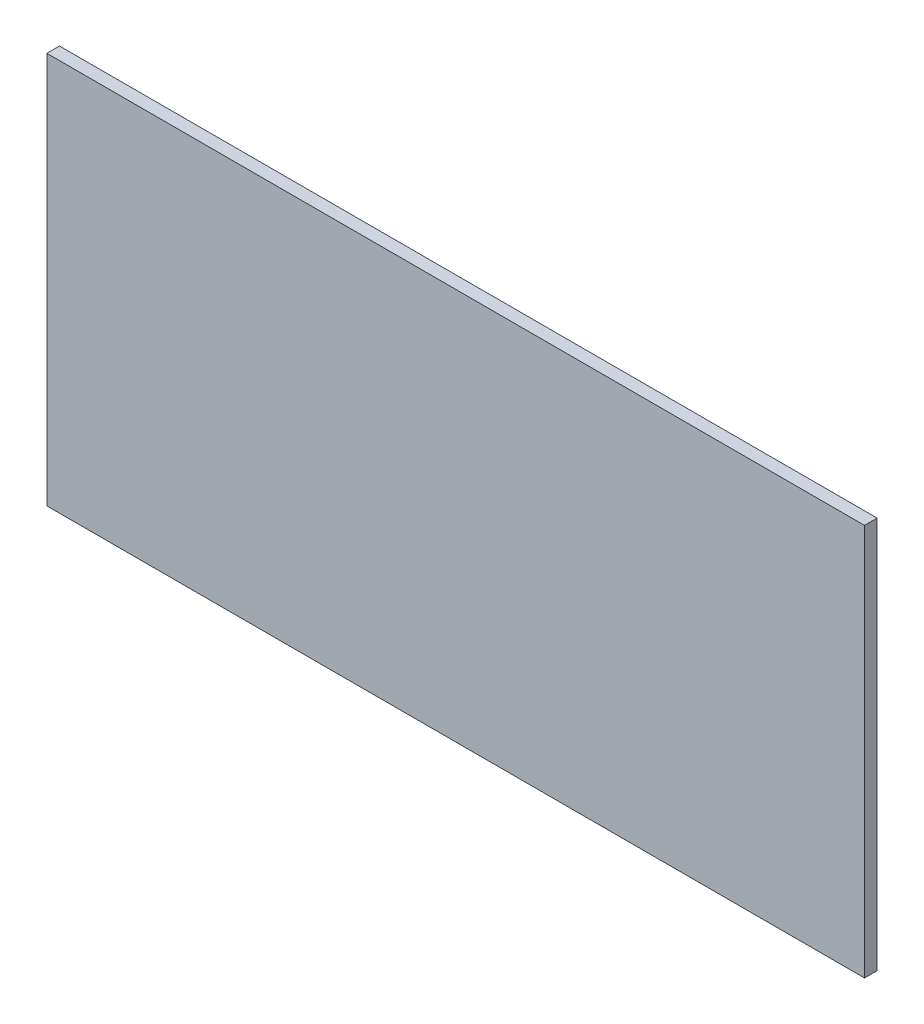
ISO-10303-21;
HEADER;
FILE_DESCRIPTION(('STEP AP214'),'2;1');
FILE_NAME('part.step','',(''),(''),'','','');
FILE_SCHEMA(('AUTOMOTIVE_DESIGN { 1 0 10303 214 1 1 1 1 }'));
ENDSEC;
DATA;
#1=APPLICATION_CONTEXT('core data for automotive mechanical design processes');
#2=APPLICATION_PROTOCOL_DEFINITION('international standard','automotive_design',2000,#1);
#3=PRODUCT_CONTEXT('',#1,'mechanical');
#4=PRODUCT('Part','Part','',(#3));
#5=PRODUCT_RELATED_PRODUCT_CATEGORY('part','',(#4));
#6=PRODUCT_DEFINITION_FORMATION('','',#4);
#7=PRODUCT_DEFINITION_CONTEXT('part definition',#1,'design');
#8=PRODUCT_DEFINITION('design','',#6,#7);
#9=PRODUCT_DEFINITION_SHAPE('','',#8);
#10=(LENGTH_UNIT() NAMED_UNIT(*) SI_UNIT(.MILLI.,.METRE.));
#11=(NAMED_UNIT(*) PLANE_ANGLE_UNIT() SI_UNIT($,.RADIAN.));
#12=(NAMED_UNIT(*) SI_UNIT($,.STERADIAN.) SOLID_ANGLE_UNIT());
#13=UNCERTAINTY_MEASURE_WITH_UNIT(LENGTH_MEASURE(1.E-05),#10,'distance_accuracy_value','');
#14=(GEOMETRIC_REPRESENTATION_CONTEXT(3) GLOBAL_UNCERTAINTY_ASSIGNED_CONTEXT((#13)) GLOBAL_UNIT_ASSIGNED_CONTEXT((#10,
#11,#12)) REPRESENTATION_CONTEXT('',''));
#15=CARTESIAN_POINT('',(0.,0.,0.));
#16=DIRECTION('',(0.,0.,1.));
#17=DIRECTION('',(1.,0.,0.));
#18=AXIS2_PLACEMENT_3D('',#15,#16,#17);
#19=CARTESIAN_POINT('',(0.,0.,3.));
#20=DIRECTION('',(1.,0.,0.));
#21=DIRECTION('',(0.,0.,-1.));
#22=AXIS2_PLACEMENT_3D('',#19,#20,#21);
#23=PLANE('',#22);
#24=DIRECTION('',(0.,-1.,0.));
#25=VECTOR('',#24,1.);
#26=CARTESIAN_POINT('',(0.,0.,0.));
#27=LINE('',#26,#25);
#28=CARTESIAN_POINT('',(0.,93.,0.));
#29=VERTEX_POINT('',#28);
#30=CARTESIAN_POINT('',(0.,0.,0.));
#31=VERTEX_POINT('',#30);
#32=EDGE_CURVE('E105',#29,#31,#27,.T.);
#33=ORIENTED_EDGE('',*,*,#32,.T.);
#34=DIRECTION('',(0.,0.,-1.));
#35=VECTOR('',#34,1.);
#36=CARTESIAN_POINT('',(0.,0.,3.));
#37=LINE('',#36,#35);
#38=CARTESIAN_POINT('',(0.,0.,3.));
#39=VERTEX_POINT('',#38);
#40=EDGE_CURVE('E11',#39,#31,#37,.T.);
#41=ORIENTED_EDGE('',*,*,#40,.F.);
#42=DIRECTION('',(0.,-1.,0.));
#43=VECTOR('',#42,1.);
#44=CARTESIAN_POINT('',(0.,0.,3.));
#45=LINE('',#44,#43);
#46=CARTESIAN_POINT('',(0.,93.,3.));
#47=VERTEX_POINT('',#46);
#48=EDGE_CURVE('E89',#47,#39,#45,.T.);
#49=ORIENTED_EDGE('',*,*,#48,.F.);
#50=DIRECTION('',(0.,0.,-1.));
#51=VECTOR('',#50,1.);
#52=CARTESIAN_POINT('',(0.,93.,3.));
#53=LINE('',#52,#51);
#54=EDGE_CURVE('E97',#47,#29,#53,.T.);
#55=ORIENTED_EDGE('',*,*,#54,.T.);
#56=EDGE_LOOP('',(#33,#41,#49,#55));
#57=FACE_BOUND('',#56,.T.);
#58=ADVANCED_FACE('F39',(#57),#23,.F.);
#59=CARTESIAN_POINT('',(0.,0.,3.));
#60=DIRECTION('',(0.,1.,0.));
#61=DIRECTION('',(0.,0.,1.));
#62=AXIS2_PLACEMENT_3D('',#59,#60,#61);
#63=PLANE('',#62);
#64=DIRECTION('',(1.,0.,0.));
#65=VECTOR('',#64,1.);
#66=CARTESIAN_POINT('',(0.,0.,0.));
#67=LINE('',#66,#65);
#68=CARTESIAN_POINT('',(194.,0.,0.));
#69=VERTEX_POINT('',#68);
#70=EDGE_CURVE('E92',#31,#69,#67,.T.);
#71=ORIENTED_EDGE('',*,*,#70,.T.);
#72=DIRECTION('',(0.,0.,-1.));
#73=VECTOR('',#72,1.);
#74=CARTESIAN_POINT('',(194.,0.,3.));
#75=LINE('',#74,#73);
#76=CARTESIAN_POINT('',(194.,0.,3.));
#77=VERTEX_POINT('',#76);
#78=EDGE_CURVE('E50',#77,#69,#75,.T.);
#79=ORIENTED_EDGE('',*,*,#78,.F.);
#80=DIRECTION('',(1.,0.,0.));
#81=VECTOR('',#80,1.);
#82=CARTESIAN_POINT('',(0.,0.,3.));
#83=LINE('',#82,#81);
#84=EDGE_CURVE('E82',#39,#77,#83,.T.);
#85=ORIENTED_EDGE('',*,*,#84,.F.);
#86=ORIENTED_EDGE('',*,*,#40,.T.);
#87=EDGE_LOOP('',(#71,#79,#85,#86));
#88=FACE_BOUND('',#87,.T.);
#89=ADVANCED_FACE('F93',(#88),#63,.F.);
#90=CARTESIAN_POINT('',(194.,0.,3.));
#91=DIRECTION('',(-1.,0.,0.));
#92=DIRECTION('',(0.,0.,1.));
#93=AXIS2_PLACEMENT_3D('',#90,#91,#92);
#94=PLANE('',#93);
#95=DIRECTION('',(0.,1.,0.));
#96=VECTOR('',#95,1.);
#97=CARTESIAN_POINT('',(194.,0.,0.));
#98=LINE('',#97,#96);
#99=CARTESIAN_POINT('',(194.,93.,0.));
#100=VERTEX_POINT('',#99);
#101=EDGE_CURVE('E72',#69,#100,#98,.T.);
#102=ORIENTED_EDGE('',*,*,#101,.T.);
#103=DIRECTION('',(0.,0.,-1.));
#104=VECTOR('',#103,1.);
#105=CARTESIAN_POINT('',(194.,93.,3.));
#106=LINE('',#105,#104);
#107=CARTESIAN_POINT('',(194.,93.,3.));
#108=VERTEX_POINT('',#107);
#109=EDGE_CURVE('E94',#108,#100,#106,.T.);
#110=ORIENTED_EDGE('',*,*,#109,.F.);
#111=DIRECTION('',(0.,1.,0.));
#112=VECTOR('',#111,1.);
#113=CARTESIAN_POINT('',(194.,0.,3.));
#114=LINE('',#113,#112);
#115=EDGE_CURVE('E88',#77,#108,#114,.T.);
#116=ORIENTED_EDGE('',*,*,#115,.F.);
#117=ORIENTED_EDGE('',*,*,#78,.T.);
#118=EDGE_LOOP('',(#102,#110,#116,#117));
#119=FACE_BOUND('',#118,.T.);
#120=ADVANCED_FACE('F96',(#119),#94,.F.);
#121=CARTESIAN_POINT('',(0.,93.,3.));
#122=DIRECTION('',(0.,-1.,0.));
#123=DIRECTION('',(0.,0.,-1.));
#124=AXIS2_PLACEMENT_3D('',#121,#122,#123);
#125=PLANE('',#124);
#126=DIRECTION('',(-1.,0.,0.));
#127=VECTOR('',#126,1.);
#128=CARTESIAN_POINT('',(0.,93.,0.));
#129=LINE('',#128,#127);
#130=EDGE_CURVE('E76',#100,#29,#129,.T.);
#131=ORIENTED_EDGE('',*,*,#130,.T.);
#132=ORIENTED_EDGE('',*,*,#54,.F.);
#133=DIRECTION('',(-1.,0.,0.));
#134=VECTOR('',#133,1.);
#135=CARTESIAN_POINT('',(0.,93.,3.));
#136=LINE('',#135,#134);
#137=EDGE_CURVE('E54',#108,#47,#136,.T.);
#138=ORIENTED_EDGE('',*,*,#137,.F.);
#139=ORIENTED_EDGE('',*,*,#109,.T.);
#140=EDGE_LOOP('',(#131,#132,#138,#139));
#141=FACE_BOUND('',#140,.T.);
#142=ADVANCED_FACE('F108',(#141),#125,.F.);
#143=CARTESIAN_POINT('',(0.,0.,3.));
#144=DIRECTION('',(0.,0.,-1.));
#145=DIRECTION('',(-1.,0.,0.));
#146=AXIS2_PLACEMENT_3D('',#143,#144,#145);
#147=PLANE('',#146);
#148=ORIENTED_EDGE('',*,*,#48,.T.);
#149=ORIENTED_EDGE('',*,*,#84,.T.);
#150=ORIENTED_EDGE('',*,*,#115,.T.);
#151=ORIENTED_EDGE('',*,*,#137,.T.);
#152=EDGE_LOOP('',(#148,#149,#150,#151));
#153=FACE_BOUND('',#152,.T.);
#154=ADVANCED_FACE('F86',(#153),#147,.F.);
#155=CARTESIAN_POINT('',(0.,0.,0.));
#156=DIRECTION('',(0.,0.,-1.));
#157=DIRECTION('',(-1.,0.,0.));
#158=AXIS2_PLACEMENT_3D('',#155,#156,#157);
#159=PLANE('',#158);
#160=ORIENTED_EDGE('',*,*,#32,.F.);
#161=ORIENTED_EDGE('',*,*,#130,.F.);
#162=ORIENTED_EDGE('',*,*,#101,.F.);
#163=ORIENTED_EDGE('',*,*,#70,.F.);
#164=EDGE_LOOP('',(#160,#161,#162,#163));
#165=FACE_BOUND('',#164,.T.);
#166=ADVANCED_FACE('F115',(#165),#159,.T.);
#167=CLOSED_SHELL('',(#58,#89,#120,#142,#154,#166));
#168=MANIFOLD_SOLID_BREP('B2',#167);
#169=ADVANCED_BREP_SHAPE_REPRESENTATION('',(#18,#168),#14);
#170=SHAPE_DEFINITION_REPRESENTATION(#9,#169);
ENDSEC;
END-ISO-10303-21;
